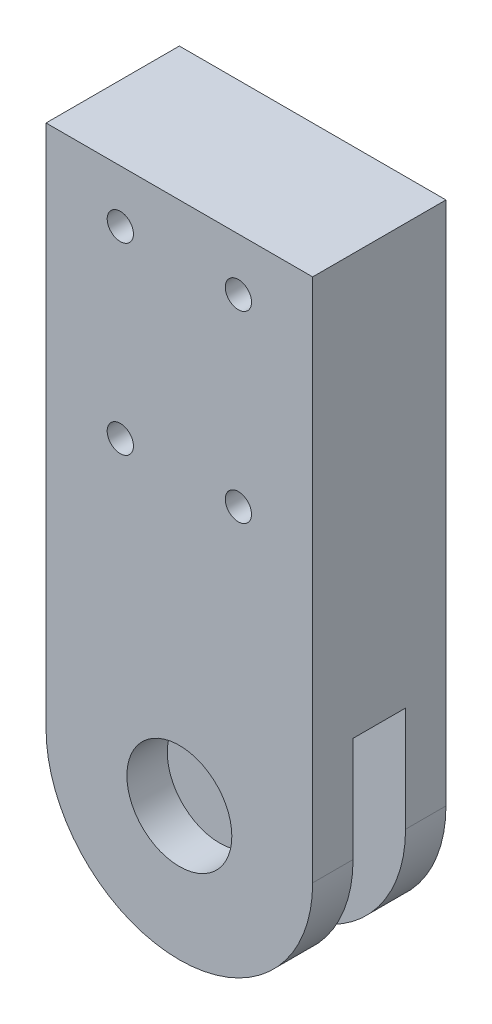
ISO-10303-21;
HEADER;
FILE_DESCRIPTION(('STEP AP214'),'2;1');
FILE_NAME('part.step','',(''),(''),'','','');
FILE_SCHEMA(('AUTOMOTIVE_DESIGN { 1 0 10303 214 1 1 1 1 }'));
ENDSEC;
DATA;
#1=APPLICATION_CONTEXT('core data for automotive mechanical design processes');
#2=APPLICATION_PROTOCOL_DEFINITION('international standard','automotive_design',2000,#1);
#3=PRODUCT_CONTEXT('',#1,'mechanical');
#4=PRODUCT('Part','Part','',(#3));
#5=PRODUCT_RELATED_PRODUCT_CATEGORY('part','',(#4));
#6=PRODUCT_DEFINITION_FORMATION('','',#4);
#7=PRODUCT_DEFINITION_CONTEXT('part definition',#1,'design');
#8=PRODUCT_DEFINITION('design','',#6,#7);
#9=PRODUCT_DEFINITION_SHAPE('','',#8);
#10=(LENGTH_UNIT() NAMED_UNIT(*) SI_UNIT(.MILLI.,.METRE.));
#11=(NAMED_UNIT(*) PLANE_ANGLE_UNIT() SI_UNIT($,.RADIAN.));
#12=(NAMED_UNIT(*) SI_UNIT($,.STERADIAN.) SOLID_ANGLE_UNIT());
#13=UNCERTAINTY_MEASURE_WITH_UNIT(LENGTH_MEASURE(1.E-05),#10,'distance_accuracy_value','');
#14=(GEOMETRIC_REPRESENTATION_CONTEXT(3) GLOBAL_UNCERTAINTY_ASSIGNED_CONTEXT((#13)) GLOBAL_UNIT_ASSIGNED_CONTEXT((#10,
#11,#12)) REPRESENTATION_CONTEXT('',''));
#15=CARTESIAN_POINT('',(0.,0.,0.));
#16=DIRECTION('',(0.,0.,1.));
#17=DIRECTION('',(1.,0.,0.));
#18=AXIS2_PLACEMENT_3D('',#15,#16,#17);
#19=CARTESIAN_POINT('',(0.,0.,25.4));
#20=DIRECTION('',(0.,0.,-1.));
#21=DIRECTION('',(-1.,0.,0.));
#22=AXIS2_PLACEMENT_3D('',#19,#20,#21);
#23=CYLINDRICAL_SURFACE('',#22,25.4);
#24=DIRECTION('',(0.,0.,-1.));
#25=VECTOR('',#24,1.);
#26=CARTESIAN_POINT('',(25.4,0.,25.4));
#27=LINE('',#26,#25);
#28=CARTESIAN_POINT('',(25.4,0.,7.7));
#29=VERTEX_POINT('',#28);
#30=CARTESIAN_POINT('',(25.4,0.,0.));
#31=VERTEX_POINT('',#30);
#32=EDGE_CURVE('E70',#29,#31,#27,.T.);
#33=ORIENTED_EDGE('',*,*,#32,.F.);
#34=CARTESIAN_POINT('',(0.,0.,7.7));
#35=DIRECTION('',(0.,0.,-1.));
#36=DIRECTION('',(0.,1.,0.));
#37=AXIS2_PLACEMENT_3D('',#34,#35,#36);
#38=CIRCLE('',#37,25.4);
#39=CARTESIAN_POINT('',(-25.4,0.,7.7));
#40=VERTEX_POINT('',#39);
#41=EDGE_CURVE('E179',#29,#40,#38,.T.);
#42=ORIENTED_EDGE('',*,*,#41,.T.);
#43=DIRECTION('',(0.,0.,-1.));
#44=VECTOR('',#43,1.);
#45=CARTESIAN_POINT('',(-25.4,0.,25.4));
#46=LINE('',#45,#44);
#47=CARTESIAN_POINT('',(-25.4,0.,0.));
#48=VERTEX_POINT('',#47);
#49=EDGE_CURVE('E109',#40,#48,#46,.T.);
#50=ORIENTED_EDGE('',*,*,#49,.T.);
#51=CARTESIAN_POINT('',(0.,0.,0.));
#52=DIRECTION('',(0.,0.,1.));
#53=DIRECTION('',(1.,0.,0.));
#54=AXIS2_PLACEMENT_3D('',#51,#52,#53);
#55=CIRCLE('',#54,25.4);
#56=EDGE_CURVE('E187',#48,#31,#55,.T.);
#57=ORIENTED_EDGE('',*,*,#56,.T.);
#58=EDGE_LOOP('',(#33,#42,#50,#57));
#59=FACE_BOUND('',#58,.T.);
#60=ADVANCED_FACE('F60',(#59),#23,.T.);
#61=CARTESIAN_POINT('',(0.,0.,25.4));
#62=DIRECTION('',(0.,0.,-1.));
#63=DIRECTION('',(-1.,0.,0.));
#64=AXIS2_PLACEMENT_3D('',#61,#62,#63);
#65=CYLINDRICAL_SURFACE('',#64,10.);
#66=CARTESIAN_POINT('',(0.,0.,7.7));
#67=DIRECTION('',(0.,0.,-1.));
#68=DIRECTION('',(0.,1.,0.));
#69=AXIS2_PLACEMENT_3D('',#66,#67,#68);
#70=CIRCLE('',#69,10.);
#71=CARTESIAN_POINT('',(0.,10.,7.7));
#72=VERTEX_POINT('',#71);
#73=EDGE_CURVE('E64',#72,#72,#70,.T.);
#74=ORIENTED_EDGE('',*,*,#73,.F.);
#75=EDGE_LOOP('',(#74));
#76=FACE_BOUND('',#75,.T.);
#77=CARTESIAN_POINT('',(0.,0.,0.));
#78=DIRECTION('',(0.,0.,1.));
#79=DIRECTION('',(1.,0.,0.));
#80=AXIS2_PLACEMENT_3D('',#77,#78,#79);
#81=CIRCLE('',#80,10.);
#82=CARTESIAN_POINT('',(10.,0.,0.));
#83=VERTEX_POINT('',#82);
#84=EDGE_CURVE('E182',#83,#83,#81,.T.);
#85=ORIENTED_EDGE('',*,*,#84,.F.);
#86=EDGE_LOOP('',(#85));
#87=FACE_BOUND('',#86,.T.);
#88=ADVANCED_FACE('F235',(#76,#87),#65,.F.);
#89=CARTESIAN_POINT('',(0.,0.,25.4));
#90=DIRECTION('',(0.,0.,1.));
#91=DIRECTION('',(1.,0.,0.));
#92=AXIS2_PLACEMENT_3D('',#89,#90,#91);
#93=PLANE('',#92);
#94=CARTESIAN_POINT('',(-11.25,90.,25.4));
#95=DIRECTION('',(0.,0.,1.));
#96=DIRECTION('',(1.,0.,0.));
#97=AXIS2_PLACEMENT_3D('',#94,#95,#96);
#98=CIRCLE('',#97,2.5);
#99=CARTESIAN_POINT('',(-8.75,90.,25.4));
#100=VERTEX_POINT('',#99);
#101=EDGE_CURVE('E326',#100,#100,#98,.T.);
#102=ORIENTED_EDGE('',*,*,#101,.F.);
#103=EDGE_LOOP('',(#102));
#104=FACE_BOUND('',#103,.T.);
#105=CARTESIAN_POINT('',(11.25,55.,25.4));
#106=DIRECTION('',(0.,0.,1.));
#107=DIRECTION('',(1.,0.,0.));
#108=AXIS2_PLACEMENT_3D('',#105,#106,#107);
#109=CIRCLE('',#108,2.5);
#110=CARTESIAN_POINT('',(13.75,55.,25.4));
#111=VERTEX_POINT('',#110);
#112=EDGE_CURVE('E322',#111,#111,#109,.T.);
#113=ORIENTED_EDGE('',*,*,#112,.F.);
#114=EDGE_LOOP('',(#113));
#115=FACE_BOUND('',#114,.T.);
#116=CARTESIAN_POINT('',(-11.25,55.,25.4));
#117=DIRECTION('',(0.,0.,1.));
#118=DIRECTION('',(1.,0.,0.));
#119=AXIS2_PLACEMENT_3D('',#116,#117,#118);
#120=CIRCLE('',#119,2.50000000000001);
#121=CARTESIAN_POINT('',(-8.74999999999999,55.,25.4));
#122=VERTEX_POINT('',#121);
#123=EDGE_CURVE('E314',#122,#122,#120,.T.);
#124=ORIENTED_EDGE('',*,*,#123,.F.);
#125=EDGE_LOOP('',(#124));
#126=FACE_BOUND('',#125,.T.);
#127=CARTESIAN_POINT('',(11.25,90.,25.4));
#128=DIRECTION('',(0.,0.,1.));
#129=DIRECTION('',(1.,0.,0.));
#130=AXIS2_PLACEMENT_3D('',#127,#128,#129);
#131=CIRCLE('',#130,2.50000000000001);
#132=CARTESIAN_POINT('',(13.75,90.,25.4));
#133=VERTEX_POINT('',#132);
#134=EDGE_CURVE('E330',#133,#133,#131,.T.);
#135=ORIENTED_EDGE('',*,*,#134,.F.);
#136=EDGE_LOOP('',(#135));
#137=FACE_BOUND('',#136,.T.);
#138=CARTESIAN_POINT('',(0.,0.,25.4));
#139=DIRECTION('',(0.,0.,1.));
#140=DIRECTION('',(1.,0.,0.));
#141=AXIS2_PLACEMENT_3D('',#138,#139,#140);
#142=CIRCLE('',#141,25.4);
#143=CARTESIAN_POINT('',(-25.4,0.,25.4));
#144=VERTEX_POINT('',#143);
#145=CARTESIAN_POINT('',(25.4,0.,25.4));
#146=VERTEX_POINT('',#145);
#147=EDGE_CURVE('E191',#144,#146,#142,.T.);
#148=ORIENTED_EDGE('',*,*,#147,.T.);
#149=DIRECTION('',(0.,1.,0.));
#150=VECTOR('',#149,1.);
#151=CARTESIAN_POINT('',(25.4,0.,25.4));
#152=LINE('',#151,#150);
#153=CARTESIAN_POINT('',(25.4,100.,25.4));
#154=VERTEX_POINT('',#153);
#155=EDGE_CURVE('E116',#146,#154,#152,.T.);
#156=ORIENTED_EDGE('',*,*,#155,.T.);
#157=DIRECTION('',(1.,0.,0.));
#158=VECTOR('',#157,1.);
#159=CARTESIAN_POINT('',(-25.4,100.,25.4));
#160=LINE('',#159,#158);
#161=CARTESIAN_POINT('',(-25.4,100.,25.4));
#162=VERTEX_POINT('',#161);
#163=EDGE_CURVE('E197',#162,#154,#160,.T.);
#164=ORIENTED_EDGE('',*,*,#163,.F.);
#165=DIRECTION('',(0.,1.,0.));
#166=VECTOR('',#165,1.);
#167=CARTESIAN_POINT('',(-25.4,0.,25.4));
#168=LINE('',#167,#166);
#169=EDGE_CURVE('E201',#144,#162,#168,.T.);
#170=ORIENTED_EDGE('',*,*,#169,.F.);
#171=EDGE_LOOP('',(#148,#156,#164,#170));
#172=FACE_BOUND('',#171,.T.);
#173=CARTESIAN_POINT('',(0.,0.,25.4));
#174=DIRECTION('',(0.,0.,1.));
#175=DIRECTION('',(1.,0.,0.));
#176=AXIS2_PLACEMENT_3D('',#173,#174,#175);
#177=CIRCLE('',#176,10.);
#178=CARTESIAN_POINT('',(10.,0.,25.4));
#179=VERTEX_POINT('',#178);
#180=EDGE_CURVE('E183',#179,#179,#177,.T.);
#181=ORIENTED_EDGE('',*,*,#180,.F.);
#182=EDGE_LOOP('',(#181));
#183=FACE_BOUND('',#182,.T.);
#184=ADVANCED_FACE('F238',(#104,#115,#126,#137,#172,#183),#93,.T.);
#185=CARTESIAN_POINT('',(0.,0.,0.));
#186=DIRECTION('',(0.,0.,1.));
#187=DIRECTION('',(1.,0.,0.));
#188=AXIS2_PLACEMENT_3D('',#185,#186,#187);
#189=PLANE('',#188);
#190=CARTESIAN_POINT('',(-11.25,90.,0.));
#191=DIRECTION('',(0.,0.,1.));
#192=DIRECTION('',(1.,0.,0.));
#193=AXIS2_PLACEMENT_3D('',#190,#191,#192);
#194=CIRCLE('',#193,2.5);
#195=CARTESIAN_POINT('',(-8.75,90.,0.));
#196=VERTEX_POINT('',#195);
#197=EDGE_CURVE('E331',#196,#196,#194,.T.);
#198=ORIENTED_EDGE('',*,*,#197,.T.);
#199=EDGE_LOOP('',(#198));
#200=FACE_BOUND('',#199,.T.);
#201=CARTESIAN_POINT('',(11.25,55.,0.));
#202=DIRECTION('',(0.,0.,1.));
#203=DIRECTION('',(1.,0.,0.));
#204=AXIS2_PLACEMENT_3D('',#201,#202,#203);
#205=CIRCLE('',#204,2.5);
#206=CARTESIAN_POINT('',(13.75,55.,0.));
#207=VERTEX_POINT('',#206);
#208=EDGE_CURVE('E317',#207,#207,#205,.T.);
#209=ORIENTED_EDGE('',*,*,#208,.T.);
#210=EDGE_LOOP('',(#209));
#211=FACE_BOUND('',#210,.T.);
#212=CARTESIAN_POINT('',(-11.25,55.,0.));
#213=DIRECTION('',(0.,0.,1.));
#214=DIRECTION('',(1.,0.,0.));
#215=AXIS2_PLACEMENT_3D('',#212,#213,#214);
#216=CIRCLE('',#215,2.50000000000001);
#217=CARTESIAN_POINT('',(-8.74999999999999,55.,0.));
#218=VERTEX_POINT('',#217);
#219=EDGE_CURVE('E311',#218,#218,#216,.T.);
#220=ORIENTED_EDGE('',*,*,#219,.T.);
#221=EDGE_LOOP('',(#220));
#222=FACE_BOUND('',#221,.T.);
#223=CARTESIAN_POINT('',(11.25,90.,0.));
#224=DIRECTION('',(0.,0.,1.));
#225=DIRECTION('',(1.,0.,0.));
#226=AXIS2_PLACEMENT_3D('',#223,#224,#225);
#227=CIRCLE('',#226,2.50000000000001);
#228=CARTESIAN_POINT('',(13.75,90.,0.));
#229=VERTEX_POINT('',#228);
#230=EDGE_CURVE('E169',#229,#229,#227,.T.);
#231=ORIENTED_EDGE('',*,*,#230,.T.);
#232=EDGE_LOOP('',(#231));
#233=FACE_BOUND('',#232,.T.);
#234=ORIENTED_EDGE('',*,*,#56,.F.);
#235=DIRECTION('',(0.,1.,0.));
#236=VECTOR('',#235,1.);
#237=CARTESIAN_POINT('',(-25.4,0.,0.));
#238=LINE('',#237,#236);
#239=CARTESIAN_POINT('',(-25.4,100.,0.));
#240=VERTEX_POINT('',#239);
#241=EDGE_CURVE('E194',#48,#240,#238,.T.);
#242=ORIENTED_EDGE('',*,*,#241,.T.);
#243=DIRECTION('',(1.,0.,0.));
#244=VECTOR('',#243,1.);
#245=CARTESIAN_POINT('',(-25.4,100.,0.));
#246=LINE('',#245,#244);
#247=CARTESIAN_POINT('',(25.4,100.,0.));
#248=VERTEX_POINT('',#247);
#249=EDGE_CURVE('E210',#240,#248,#246,.T.);
#250=ORIENTED_EDGE('',*,*,#249,.T.);
#251=DIRECTION('',(0.,1.,0.));
#252=VECTOR('',#251,1.);
#253=CARTESIAN_POINT('',(25.4,0.,0.));
#254=LINE('',#253,#252);
#255=EDGE_CURVE('E206',#31,#248,#254,.T.);
#256=ORIENTED_EDGE('',*,*,#255,.F.);
#257=EDGE_LOOP('',(#234,#242,#250,#256));
#258=FACE_BOUND('',#257,.T.);
#259=ORIENTED_EDGE('',*,*,#84,.T.);
#260=EDGE_LOOP('',(#259));
#261=FACE_BOUND('',#260,.T.);
#262=ADVANCED_FACE('F240',(#200,#211,#222,#233,#258,#261),#189,.F.);
#263=CARTESIAN_POINT('',(0.,0.,17.7));
#264=DIRECTION('',(0.,0.,1.));
#265=DIRECTION('',(0.,-1.,0.));
#266=AXIS2_PLACEMENT_3D('',#263,#264,#265);
#267=CIRCLE('',#266,25.4);
#268=CARTESIAN_POINT('',(-25.4,0.,17.7));
#269=VERTEX_POINT('',#268);
#270=CARTESIAN_POINT('',(25.4,0.,17.7));
#271=VERTEX_POINT('',#270);
#272=EDGE_CURVE('E78',#269,#271,#267,.T.);
#273=ORIENTED_EDGE('',*,*,#272,.T.);
#274=EDGE_CURVE('E12',#146,#271,#27,.T.);
#275=ORIENTED_EDGE('',*,*,#274,.F.);
#276=ORIENTED_EDGE('',*,*,#147,.F.);
#277=EDGE_CURVE('E86',#144,#269,#46,.T.);
#278=ORIENTED_EDGE('',*,*,#277,.T.);
#279=EDGE_LOOP('',(#273,#275,#276,#278));
#280=FACE_BOUND('',#279,.T.);
#281=ADVANCED_FACE('F62',(#280),#23,.T.);
#282=CARTESIAN_POINT('',(25.4,0.,25.4));
#283=DIRECTION('',(-1.,0.,0.));
#284=DIRECTION('',(0.,0.,1.));
#285=AXIS2_PLACEMENT_3D('',#282,#283,#284);
#286=PLANE('',#285);
#287=DIRECTION('',(0.,0.,-1.));
#288=VECTOR('',#287,1.);
#289=CARTESIAN_POINT('',(25.4,20.,7.7));
#290=LINE('',#289,#288);
#291=CARTESIAN_POINT('',(25.4,20.,17.7));
#292=VERTEX_POINT('',#291);
#293=CARTESIAN_POINT('',(25.4,20.,7.7));
#294=VERTEX_POINT('',#293);
#295=EDGE_CURVE('E147',#292,#294,#290,.T.);
#296=ORIENTED_EDGE('',*,*,#295,.T.);
#297=DIRECTION('',(0.,-1.,0.));
#298=VECTOR('',#297,1.);
#299=CARTESIAN_POINT('',(25.4,20.,7.7));
#300=LINE('',#299,#298);
#301=EDGE_CURVE('E158',#294,#29,#300,.T.);
#302=ORIENTED_EDGE('',*,*,#301,.T.);
#303=ORIENTED_EDGE('',*,*,#32,.T.);
#304=ORIENTED_EDGE('',*,*,#255,.T.);
#305=DIRECTION('',(0.,0.,-1.));
#306=VECTOR('',#305,1.);
#307=CARTESIAN_POINT('',(25.4,100.,25.4));
#308=LINE('',#307,#306);
#309=EDGE_CURVE('E222',#154,#248,#308,.T.);
#310=ORIENTED_EDGE('',*,*,#309,.F.);
#311=ORIENTED_EDGE('',*,*,#155,.F.);
#312=ORIENTED_EDGE('',*,*,#274,.T.);
#313=DIRECTION('',(0.,1.,0.));
#314=VECTOR('',#313,1.);
#315=CARTESIAN_POINT('',(25.4,20.,17.7));
#316=LINE('',#315,#314);
#317=EDGE_CURVE('E140',#271,#292,#316,.T.);
#318=ORIENTED_EDGE('',*,*,#317,.T.);
#319=EDGE_LOOP('',(#296,#302,#303,#304,#310,#311,#312,#318));
#320=FACE_BOUND('',#319,.T.);
#321=ADVANCED_FACE('F155',(#320),#286,.F.);
#322=CARTESIAN_POINT('',(-25.4,100.,25.4));
#323=DIRECTION('',(0.,1.,0.));
#324=DIRECTION('',(0.,0.,1.));
#325=AXIS2_PLACEMENT_3D('',#322,#323,#324);
#326=PLANE('',#325);
#327=ORIENTED_EDGE('',*,*,#249,.F.);
#328=DIRECTION('',(0.,0.,-1.));
#329=VECTOR('',#328,1.);
#330=CARTESIAN_POINT('',(-25.4,100.,25.4));
#331=LINE('',#330,#329);
#332=EDGE_CURVE('E219',#162,#240,#331,.T.);
#333=ORIENTED_EDGE('',*,*,#332,.F.);
#334=ORIENTED_EDGE('',*,*,#163,.T.);
#335=ORIENTED_EDGE('',*,*,#309,.T.);
#336=EDGE_LOOP('',(#327,#333,#334,#335));
#337=FACE_BOUND('',#336,.T.);
#338=ADVANCED_FACE('F263',(#337),#326,.T.);
#339=CARTESIAN_POINT('',(-25.4,0.,25.4));
#340=DIRECTION('',(-1.,0.,0.));
#341=DIRECTION('',(0.,0.,1.));
#342=AXIS2_PLACEMENT_3D('',#339,#340,#341);
#343=PLANE('',#342);
#344=DIRECTION('',(0.,-1.,0.));
#345=VECTOR('',#344,1.);
#346=CARTESIAN_POINT('',(-25.4,20.,7.7));
#347=LINE('',#346,#345);
#348=CARTESIAN_POINT('',(-25.4,20.,7.7));
#349=VERTEX_POINT('',#348);
#350=EDGE_CURVE('E165',#349,#40,#347,.T.);
#351=ORIENTED_EDGE('',*,*,#350,.F.);
#352=DIRECTION('',(0.,0.,-1.));
#353=VECTOR('',#352,1.);
#354=CARTESIAN_POINT('',(-25.4,20.,7.7));
#355=LINE('',#354,#353);
#356=CARTESIAN_POINT('',(-25.4,20.,17.7));
#357=VERTEX_POINT('',#356);
#358=EDGE_CURVE('E161',#357,#349,#355,.T.);
#359=ORIENTED_EDGE('',*,*,#358,.F.);
#360=DIRECTION('',(0.,1.,0.));
#361=VECTOR('',#360,1.);
#362=CARTESIAN_POINT('',(-25.4,20.,17.7));
#363=LINE('',#362,#361);
#364=EDGE_CURVE('E141',#269,#357,#363,.T.);
#365=ORIENTED_EDGE('',*,*,#364,.F.);
#366=ORIENTED_EDGE('',*,*,#277,.F.);
#367=ORIENTED_EDGE('',*,*,#169,.T.);
#368=ORIENTED_EDGE('',*,*,#332,.T.);
#369=ORIENTED_EDGE('',*,*,#241,.F.);
#370=ORIENTED_EDGE('',*,*,#49,.F.);
#371=EDGE_LOOP('',(#351,#359,#365,#366,#367,#368,#369,#370));
#372=FACE_BOUND('',#371,.T.);
#373=ADVANCED_FACE('F233',(#372),#343,.T.);
#374=CARTESIAN_POINT('',(0.,0.,17.7));
#375=DIRECTION('',(0.,0.,1.));
#376=DIRECTION('',(0.,-1.,0.));
#377=AXIS2_PLACEMENT_3D('',#374,#375,#376);
#378=CIRCLE('',#377,10.);
#379=CARTESIAN_POINT('',(0.,-10.,17.7));
#380=VERTEX_POINT('',#379);
#381=EDGE_CURVE('E175',#380,#380,#378,.T.);
#382=ORIENTED_EDGE('',*,*,#381,.F.);
#383=EDGE_LOOP('',(#382));
#384=FACE_BOUND('',#383,.T.);
#385=ORIENTED_EDGE('',*,*,#180,.T.);
#386=EDGE_LOOP('',(#385));
#387=FACE_BOUND('',#386,.T.);
#388=ADVANCED_FACE('F229',(#384,#387),#65,.F.);
#389=CARTESIAN_POINT('',(25.4,20.,7.7));
#390=DIRECTION('',(0.,0.,-1.));
#391=DIRECTION('',(0.,1.,0.));
#392=AXIS2_PLACEMENT_3D('',#389,#390,#391);
#393=PLANE('',#392);
#394=ORIENTED_EDGE('',*,*,#73,.T.);
#395=EDGE_LOOP('',(#394));
#396=FACE_BOUND('',#395,.T.);
#397=ORIENTED_EDGE('',*,*,#301,.F.);
#398=DIRECTION('',(-1.,0.,0.));
#399=VECTOR('',#398,1.);
#400=CARTESIAN_POINT('',(25.4,20.,7.7));
#401=LINE('',#400,#399);
#402=EDGE_CURVE('E146',#294,#349,#401,.T.);
#403=ORIENTED_EDGE('',*,*,#402,.T.);
#404=ORIENTED_EDGE('',*,*,#350,.T.);
#405=ORIENTED_EDGE('',*,*,#41,.F.);
#406=EDGE_LOOP('',(#397,#403,#404,#405));
#407=FACE_BOUND('',#406,.T.);
#408=ADVANCED_FACE('F232',(#396,#407),#393,.F.);
#409=CARTESIAN_POINT('',(25.4,20.,17.7));
#410=DIRECTION('',(0.,0.,1.));
#411=DIRECTION('',(0.,-1.,0.));
#412=AXIS2_PLACEMENT_3D('',#409,#410,#411);
#413=PLANE('',#412);
#414=ORIENTED_EDGE('',*,*,#381,.T.);
#415=EDGE_LOOP('',(#414));
#416=FACE_BOUND('',#415,.T.);
#417=ORIENTED_EDGE('',*,*,#272,.F.);
#418=ORIENTED_EDGE('',*,*,#364,.T.);
#419=DIRECTION('',(-1.,0.,0.));
#420=VECTOR('',#419,1.);
#421=CARTESIAN_POINT('',(25.4,20.,17.7));
#422=LINE('',#421,#420);
#423=EDGE_CURVE('E136',#292,#357,#422,.T.);
#424=ORIENTED_EDGE('',*,*,#423,.F.);
#425=ORIENTED_EDGE('',*,*,#317,.F.);
#426=EDGE_LOOP('',(#417,#418,#424,#425));
#427=FACE_BOUND('',#426,.T.);
#428=ADVANCED_FACE('F138',(#416,#427),#413,.F.);
#429=CARTESIAN_POINT('',(25.4,20.,7.7));
#430=DIRECTION('',(0.,1.,0.));
#431=DIRECTION('',(0.,0.,1.));
#432=AXIS2_PLACEMENT_3D('',#429,#430,#431);
#433=PLANE('',#432);
#434=ORIENTED_EDGE('',*,*,#358,.T.);
#435=ORIENTED_EDGE('',*,*,#402,.F.);
#436=ORIENTED_EDGE('',*,*,#295,.F.);
#437=ORIENTED_EDGE('',*,*,#423,.T.);
#438=EDGE_LOOP('',(#434,#435,#436,#437));
#439=FACE_BOUND('',#438,.T.);
#440=ADVANCED_FACE('F150',(#439),#433,.F.);
#441=CARTESIAN_POINT('',(11.25,90.,0.));
#442=DIRECTION('',(0.,0.,1.));
#443=DIRECTION('',(1.,0.,0.));
#444=AXIS2_PLACEMENT_3D('',#441,#442,#443);
#445=CYLINDRICAL_SURFACE('',#444,2.50000000000001);
#446=ORIENTED_EDGE('',*,*,#230,.F.);
#447=EDGE_LOOP('',(#446));
#448=FACE_BOUND('',#447,.T.);
#449=ORIENTED_EDGE('',*,*,#134,.T.);
#450=EDGE_LOOP('',(#449));
#451=FACE_BOUND('',#450,.T.);
#452=ADVANCED_FACE('F291',(#448,#451),#445,.F.);
#453=CARTESIAN_POINT('',(-11.25,55.,0.));
#454=DIRECTION('',(0.,0.,1.));
#455=DIRECTION('',(1.,0.,0.));
#456=AXIS2_PLACEMENT_3D('',#453,#454,#455);
#457=CYLINDRICAL_SURFACE('',#456,2.50000000000001);
#458=ORIENTED_EDGE('',*,*,#219,.F.);
#459=EDGE_LOOP('',(#458));
#460=FACE_BOUND('',#459,.T.);
#461=ORIENTED_EDGE('',*,*,#123,.T.);
#462=EDGE_LOOP('',(#461));
#463=FACE_BOUND('',#462,.T.);
#464=ADVANCED_FACE('F294',(#460,#463),#457,.F.);
#465=CARTESIAN_POINT('',(11.25,55.,0.));
#466=DIRECTION('',(0.,0.,1.));
#467=DIRECTION('',(1.,0.,0.));
#468=AXIS2_PLACEMENT_3D('',#465,#466,#467);
#469=CYLINDRICAL_SURFACE('',#468,2.5);
#470=ORIENTED_EDGE('',*,*,#208,.F.);
#471=EDGE_LOOP('',(#470));
#472=FACE_BOUND('',#471,.T.);
#473=ORIENTED_EDGE('',*,*,#112,.T.);
#474=EDGE_LOOP('',(#473));
#475=FACE_BOUND('',#474,.T.);
#476=ADVANCED_FACE('F296',(#472,#475),#469,.F.);
#477=CARTESIAN_POINT('',(-11.25,90.,0.));
#478=DIRECTION('',(0.,0.,1.));
#479=DIRECTION('',(1.,0.,0.));
#480=AXIS2_PLACEMENT_3D('',#477,#478,#479);
#481=CYLINDRICAL_SURFACE('',#480,2.5);
#482=ORIENTED_EDGE('',*,*,#197,.F.);
#483=EDGE_LOOP('',(#482));
#484=FACE_BOUND('',#483,.T.);
#485=ORIENTED_EDGE('',*,*,#101,.T.);
#486=EDGE_LOOP('',(#485));
#487=FACE_BOUND('',#486,.T.);
#488=ADVANCED_FACE('F299',(#484,#487),#481,.F.);
#489=CLOSED_SHELL('',(#60,#88,#184,#262,#281,#321,#338,#373,#388,#408,#428,#440,#452,#464,#476,#488));
#490=MANIFOLD_SOLID_BREP('B2',#489);
#491=ADVANCED_BREP_SHAPE_REPRESENTATION('',(#18,#490),#14);
#492=SHAPE_DEFINITION_REPRESENTATION(#9,#491);
ENDSEC;
END-ISO-10303-21;
